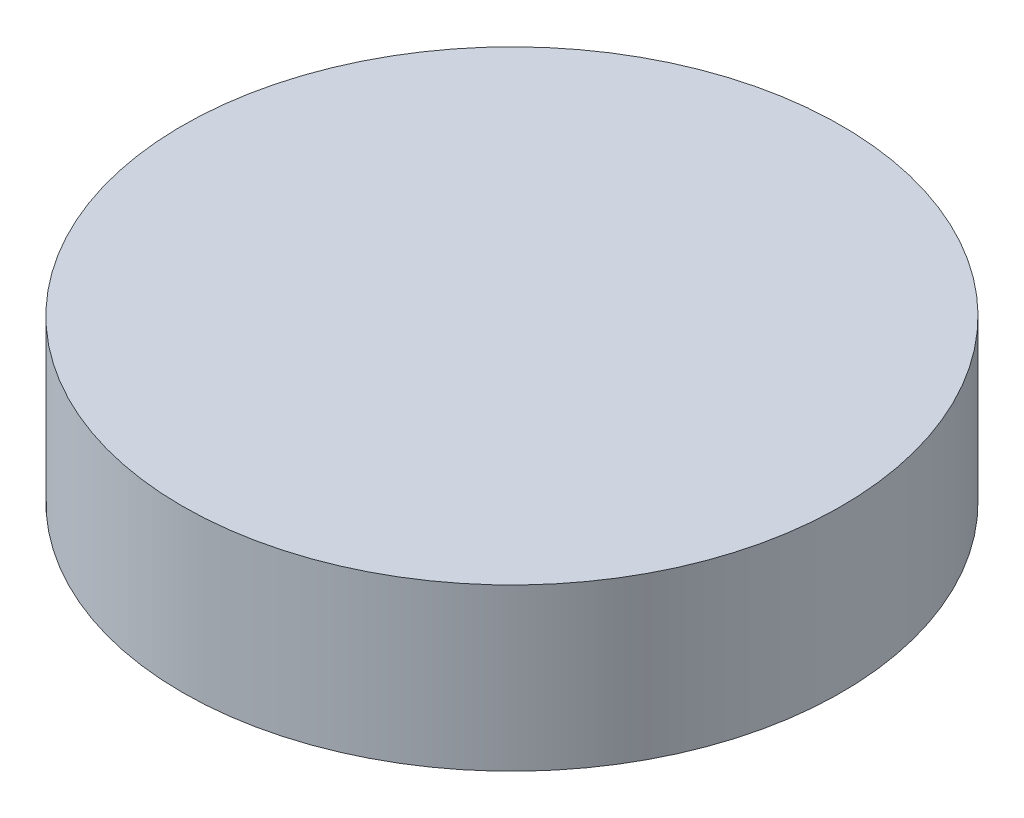
ISO-10303-21;
HEADER;
FILE_DESCRIPTION(('STEP AP214'),'2;1');
FILE_NAME('part.step','',(''),(''),'','','');
FILE_SCHEMA(('AUTOMOTIVE_DESIGN { 1 0 10303 214 1 1 1 1 }'));
ENDSEC;
DATA;
#1=APPLICATION_CONTEXT('core data for automotive mechanical design processes');
#2=APPLICATION_PROTOCOL_DEFINITION('international standard','automotive_design',2000,#1);
#3=PRODUCT_CONTEXT('',#1,'mechanical');
#4=PRODUCT('Part','Part','',(#3));
#5=PRODUCT_RELATED_PRODUCT_CATEGORY('part','',(#4));
#6=PRODUCT_DEFINITION_FORMATION('','',#4);
#7=PRODUCT_DEFINITION_CONTEXT('part definition',#1,'design');
#8=PRODUCT_DEFINITION('design','',#6,#7);
#9=PRODUCT_DEFINITION_SHAPE('','',#8);
#10=(LENGTH_UNIT() NAMED_UNIT(*) SI_UNIT(.MILLI.,.METRE.));
#11=(NAMED_UNIT(*) PLANE_ANGLE_UNIT() SI_UNIT($,.RADIAN.));
#12=(NAMED_UNIT(*) SI_UNIT($,.STERADIAN.) SOLID_ANGLE_UNIT());
#13=UNCERTAINTY_MEASURE_WITH_UNIT(LENGTH_MEASURE(1.E-05),#10,'distance_accuracy_value','');
#14=(GEOMETRIC_REPRESENTATION_CONTEXT(3) GLOBAL_UNCERTAINTY_ASSIGNED_CONTEXT((#13)) GLOBAL_UNIT_ASSIGNED_CONTEXT((#10,
#11,#12)) REPRESENTATION_CONTEXT('',''));
#15=CARTESIAN_POINT('',(0.,0.,0.));
#16=DIRECTION('',(0.,0.,1.));
#17=DIRECTION('',(1.,0.,0.));
#18=AXIS2_PLACEMENT_3D('',#15,#16,#17);
#19=CARTESIAN_POINT('',(0.,18.6,0.));
#20=DIRECTION('',(0.,-1.,0.));
#21=DIRECTION('',(0.,0.,-1.));
#22=AXIS2_PLACEMENT_3D('',#19,#20,#21);
#23=CYLINDRICAL_SURFACE('',#22,38.);
#24=CARTESIAN_POINT('',(0.,18.6,0.));
#25=DIRECTION('',(0.,1.,0.));
#26=DIRECTION('',(0.,0.,1.));
#27=AXIS2_PLACEMENT_3D('',#24,#25,#26);
#28=CIRCLE('',#27,38.);
#29=CARTESIAN_POINT('',(0.,18.6,38.));
#30=VERTEX_POINT('',#29);
#31=EDGE_CURVE('E10',#30,#30,#28,.T.);
#32=ORIENTED_EDGE('',*,*,#31,.F.);
#33=EDGE_LOOP('',(#32));
#34=FACE_BOUND('',#33,.T.);
#35=CARTESIAN_POINT('',(0.,0.,0.));
#36=DIRECTION('',(0.,1.,0.));
#37=DIRECTION('',(0.,0.,1.));
#38=AXIS2_PLACEMENT_3D('',#35,#36,#37);
#39=CIRCLE('',#38,38.);
#40=CARTESIAN_POINT('',(0.,0.,38.));
#41=VERTEX_POINT('',#40);
#42=EDGE_CURVE('E38',#41,#41,#39,.T.);
#43=ORIENTED_EDGE('',*,*,#42,.T.);
#44=EDGE_LOOP('',(#43));
#45=FACE_BOUND('',#44,.T.);
#46=ADVANCED_FACE('F35',(#34,#45),#23,.T.);
#47=CARTESIAN_POINT('',(0.,18.6,0.));
#48=DIRECTION('',(0.,1.,0.));
#49=DIRECTION('',(0.,0.,1.));
#50=AXIS2_PLACEMENT_3D('',#47,#48,#49);
#51=PLANE('',#50);
#52=ORIENTED_EDGE('',*,*,#31,.T.);
#53=EDGE_LOOP('',(#52));
#54=FACE_BOUND('',#53,.T.);
#55=ADVANCED_FACE('F50',(#54),#51,.T.);
#56=CARTESIAN_POINT('',(0.,0.,0.));
#57=DIRECTION('',(0.,1.,0.));
#58=DIRECTION('',(0.,0.,1.));
#59=AXIS2_PLACEMENT_3D('',#56,#57,#58);
#60=PLANE('',#59);
#61=ORIENTED_EDGE('',*,*,#42,.F.);
#62=EDGE_LOOP('',(#61));
#63=FACE_BOUND('',#62,.T.);
#64=ADVANCED_FACE('F48',(#63),#60,.F.);
#65=CLOSED_SHELL('',(#46,#55,#64));
#66=MANIFOLD_SOLID_BREP('B2',#65);
#67=ADVANCED_BREP_SHAPE_REPRESENTATION('',(#18,#66),#14);
#68=SHAPE_DEFINITION_REPRESENTATION(#9,#67);
ENDSEC;
END-ISO-10303-21;
